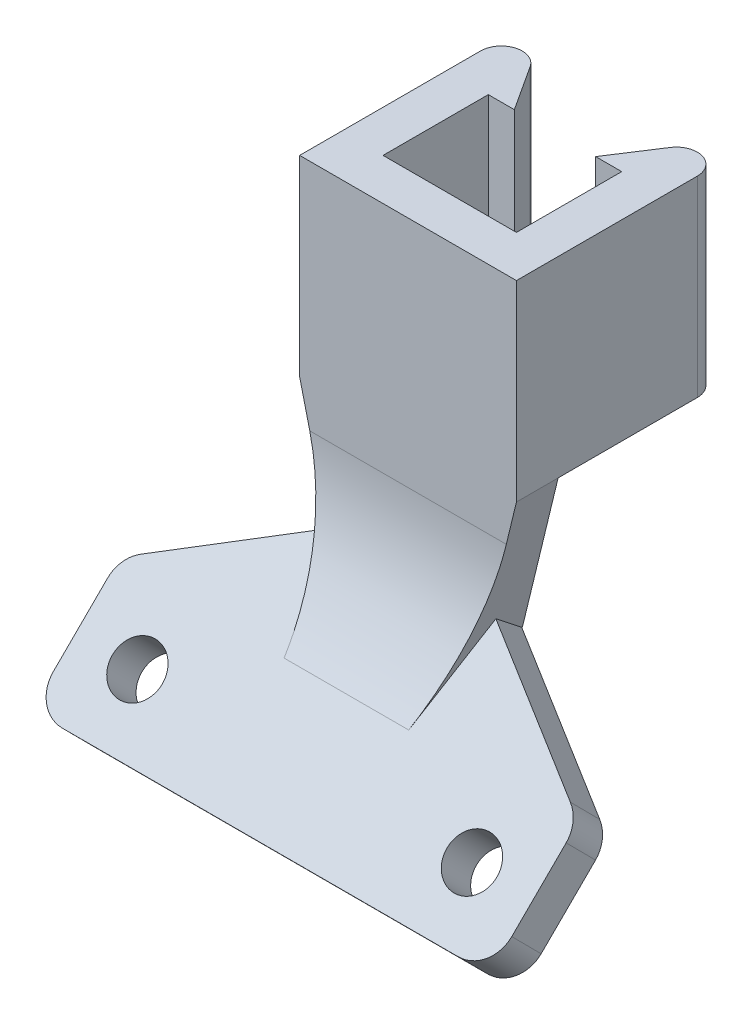
ISO-10303-21;
HEADER;
FILE_DESCRIPTION(('STEP AP214'),'2;1');
FILE_NAME('part.step','',(''),(''),'','','');
FILE_SCHEMA(('AUTOMOTIVE_DESIGN { 1 0 10303 214 1 1 1 1 }'));
ENDSEC;
DATA;
#1=APPLICATION_CONTEXT('core data for automotive mechanical design processes');
#2=APPLICATION_PROTOCOL_DEFINITION('international standard','automotive_design',2000,#1);
#3=PRODUCT_CONTEXT('',#1,'mechanical');
#4=PRODUCT('Part','Part','',(#3));
#5=PRODUCT_RELATED_PRODUCT_CATEGORY('part','',(#4));
#6=PRODUCT_DEFINITION_FORMATION('','',#4);
#7=PRODUCT_DEFINITION_CONTEXT('part definition',#1,'design');
#8=PRODUCT_DEFINITION('design','',#6,#7);
#9=PRODUCT_DEFINITION_SHAPE('','',#8);
#10=(LENGTH_UNIT() NAMED_UNIT(*) SI_UNIT(.MILLI.,.METRE.));
#11=(NAMED_UNIT(*) PLANE_ANGLE_UNIT() SI_UNIT($,.RADIAN.));
#12=(NAMED_UNIT(*) SI_UNIT($,.STERADIAN.) SOLID_ANGLE_UNIT());
#13=UNCERTAINTY_MEASURE_WITH_UNIT(LENGTH_MEASURE(1.E-05),#10,'distance_accuracy_value','');
#14=(GEOMETRIC_REPRESENTATION_CONTEXT(3) GLOBAL_UNCERTAINTY_ASSIGNED_CONTEXT((#13)) GLOBAL_UNIT_ASSIGNED_CONTEXT((#10,
#11,#12)) REPRESENTATION_CONTEXT('',''));
#15=CARTESIAN_POINT('',(0.,0.,0.));
#16=DIRECTION('',(0.,0.,1.));
#17=DIRECTION('',(1.,0.,0.));
#18=AXIS2_PLACEMENT_3D('',#15,#16,#17);
#19=CARTESIAN_POINT('',(0.3,-11.6,-10.0363471553719));
#20=DIRECTION('',(0.971753703944221,-0.235997328100739,0.));
#21=DIRECTION('',(0.235997328100739,0.971753703944221,0.));
#22=AXIS2_PLACEMENT_3D('',#19,#20,#21);
#23=PLANE('',#22);
#24=DIRECTION('',(-0.168592752666764,-0.694205452157264,0.699753723779568));
#25=VECTOR('',#24,1.);
#26=CARTESIAN_POINT('',(2.11397084096192,-4.13070830192151,-2.18923584850321));
#27=LINE('',#26,#25);
#28=CARTESIAN_POINT('',(0.60164791154541,-10.3579203642248,4.08774572203999));
#29=VERTEX_POINT('',#28);
#30=CARTESIAN_POINT('',(-0.210096759587173,-13.7003984218295,7.45693773888773));
#31=VERTEX_POINT('',#30);
#32=EDGE_CURVE('E84',#29,#31,#27,.T.);
#33=ORIENTED_EDGE('',*,*,#32,.F.);
#34=DIRECTION('',(-0.152960754174958,-0.629838399543945,-0.761515986793547));
#35=VECTOR('',#34,1.);
#36=CARTESIAN_POINT('',(-1.17027581491581,-17.6540768849475,-4.73378665309213));
#37=LINE('',#36,#35);
#38=CARTESIAN_POINT('',(0.3,-11.6,2.58598987451085));
#39=VERTEX_POINT('',#38);
#40=EDGE_CURVE('E482',#29,#39,#37,.T.);
#41=ORIENTED_EDGE('',*,*,#40,.T.);
#42=DIRECTION('',(0.,0.,1.));
#43=VECTOR('',#42,1.);
#44=CARTESIAN_POINT('',(0.3,-11.6,-10.0363471553719));
#45=LINE('',#44,#43);
#46=CARTESIAN_POINT('',(0.3,-11.6,2.5));
#47=VERTEX_POINT('',#46);
#48=EDGE_CURVE('E373',#47,#39,#45,.T.);
#49=ORIENTED_EDGE('',*,*,#48,.F.);
#50=DIRECTION('',(-0.235997328100739,-0.971753703944221,0.));
#51=VECTOR('',#50,1.);
#52=CARTESIAN_POINT('',(0.3,-11.6,2.5));
#53=LINE('',#52,#51);
#54=CARTESIAN_POINT('',(2.,-4.6,2.5));
#55=VERTEX_POINT('',#54);
#56=EDGE_CURVE('E278',#55,#47,#53,.T.);
#57=ORIENTED_EDGE('',*,*,#56,.F.);
#58=DIRECTION('',(0.,0.,-1.));
#59=VECTOR('',#58,1.);
#60=CARTESIAN_POINT('',(2.,-4.6,0.));
#61=LINE('',#60,#59);
#62=CARTESIAN_POINT('',(2.,-4.6,4.49980532051669));
#63=VERTEX_POINT('',#62);
#64=EDGE_CURVE('E446',#63,#55,#61,.T.);
#65=ORIENTED_EDGE('',*,*,#64,.F.);
#66=DIRECTION('',(0.235997328100739,0.971753703944221,0.));
#67=VECTOR('',#66,1.);
#68=CARTESIAN_POINT('',(0.3,-11.6,4.49980532051669));
#69=LINE('',#68,#67);
#70=CARTESIAN_POINT('',(1.51398398866313,-6.6012423996224,4.49980532051669));
#71=VERTEX_POINT('',#70);
#72=EDGE_CURVE('E369',#71,#63,#69,.T.);
#73=ORIENTED_EDGE('',*,*,#72,.F.);
#74=CARTESIAN_POINT('',(1.51398398866313,-6.6012423996224,14.4998053205167));
#75=DIRECTION('',(0.971753703944221,-0.235997328100739,0.));
#76=DIRECTION('',(0.235997328100739,0.971753703944221,0.));
#77=AXIS2_PLACEMENT_3D('',#74,#75,#76);
#78=ELLIPSE('',#77,10.2906734076869,10.);
#79=EDGE_CURVE('E77',#71,#31,#78,.F.);
#80=ORIENTED_EDGE('',*,*,#79,.T.);
#81=EDGE_LOOP('',(#33,#41,#49,#57,#65,#73,#80));
#82=FACE_BOUND('',#81,.T.);
#83=ADVANCED_FACE('F69',(#82),#23,.T.);
#84=CARTESIAN_POINT('',(2.,-4.6,0.));
#85=DIRECTION('',(0.,1.,0.));
#86=DIRECTION('',(0.,0.,1.));
#87=AXIS2_PLACEMENT_3D('',#84,#85,#86);
#88=PLANE('',#87);
#89=DIRECTION('',(1.,0.,0.));
#90=VECTOR('',#89,1.);
#91=CARTESIAN_POINT('',(2.,-4.6,2.5));
#92=LINE('',#91,#90);
#93=CARTESIAN_POINT('',(-8.4,-4.6,2.5));
#94=VERTEX_POINT('',#93);
#95=CARTESIAN_POINT('',(-6.4,-4.6,2.5));
#96=VERTEX_POINT('',#95);
#97=EDGE_CURVE('E375',#94,#96,#92,.T.);
#98=ORIENTED_EDGE('',*,*,#97,.F.);
#99=DIRECTION('',(0.,0.,1.));
#100=VECTOR('',#99,1.);
#101=CARTESIAN_POINT('',(-8.4,-4.6,-4.49980532051669));
#102=LINE('',#101,#100);
#103=CARTESIAN_POINT('',(-8.4,-4.6,-4.17663685509591));
#104=VERTEX_POINT('',#103);
#105=EDGE_CURVE('E422',#104,#94,#102,.T.);
#106=ORIENTED_EDGE('',*,*,#105,.F.);
#107=CARTESIAN_POINT('',(-7.4,-4.6,-4.17663685509591));
#108=DIRECTION('',(0.,1.,0.));
#109=DIRECTION('',(0.,0.,1.));
#110=AXIS2_PLACEMENT_3D('',#107,#108,#109);
#111=CIRCLE('',#110,1.);
#112=CARTESIAN_POINT('',(-6.56155638369936,-4.6,-4.72162520569133));
#113=VERTEX_POINT('',#112);
#114=EDGE_CURVE('E468',#104,#113,#111,.F.);
#115=ORIENTED_EDGE('',*,*,#114,.T.);
#116=DIRECTION('',(0.544988350595414,0.,0.838443616300637));
#117=VECTOR('',#116,1.);
#118=CARTESIAN_POINT('',(-2.45518453427065,-4.6,1.59586994727592));
#119=LINE('',#118,#117);
#120=CARTESIAN_POINT('',(-5.15,-4.6,-2.55));
#121=VERTEX_POINT('',#120);
#122=EDGE_CURVE('E412',#113,#121,#119,.T.);
#123=ORIENTED_EDGE('',*,*,#122,.T.);
#124=DIRECTION('',(-1.,0.,0.));
#125=VECTOR('',#124,1.);
#126=CARTESIAN_POINT('',(0.,-4.6,-2.54999999999998));
#127=LINE('',#126,#125);
#128=CARTESIAN_POINT('',(-6.4,-4.6,-2.55));
#129=VERTEX_POINT('',#128);
#130=EDGE_CURVE('E401',#121,#129,#127,.T.);
#131=ORIENTED_EDGE('',*,*,#130,.T.);
#132=DIRECTION('',(0.,0.,1.));
#133=VECTOR('',#132,1.);
#134=CARTESIAN_POINT('',(-6.4,-4.6,-4.49980532051669));
#135=LINE('',#134,#133);
#136=EDGE_CURVE('E417',#129,#96,#135,.T.);
#137=ORIENTED_EDGE('',*,*,#136,.T.);
#138=EDGE_LOOP('',(#98,#106,#115,#123,#131,#137));
#139=FACE_BOUND('',#138,.T.);
#140=ADVANCED_FACE('F596',(#139),#88,.F.);
#141=CARTESIAN_POINT('',(0.,-4.6,2.5));
#142=VERTEX_POINT('',#141);
#143=EDGE_CURVE('E388',#142,#55,#92,.T.);
#144=ORIENTED_EDGE('',*,*,#143,.F.);
#145=DIRECTION('',(0.,0.,-1.));
#146=VECTOR('',#145,1.);
#147=CARTESIAN_POINT('',(0.,-4.6,0.));
#148=LINE('',#147,#146);
#149=CARTESIAN_POINT('',(0.,-4.6,-2.55));
#150=VERTEX_POINT('',#149);
#151=EDGE_CURVE('E445',#142,#150,#148,.T.);
#152=ORIENTED_EDGE('',*,*,#151,.T.);
#153=DIRECTION('',(1.,0.,0.));
#154=VECTOR('',#153,1.);
#155=CARTESIAN_POINT('',(0.,-4.6,-2.55));
#156=LINE('',#155,#154);
#157=CARTESIAN_POINT('',(-1.25,-4.6,-2.55));
#158=VERTEX_POINT('',#157);
#159=EDGE_CURVE('E395',#158,#150,#156,.T.);
#160=ORIENTED_EDGE('',*,*,#159,.F.);
#161=DIRECTION('',(-0.544988350595414,0.,0.838443616300637));
#162=VECTOR('',#161,1.);
#163=CARTESIAN_POINT('',(-2.04393673110721,-4.6,-1.32855887521968));
#164=LINE('',#163,#162);
#165=CARTESIAN_POINT('',(0.161556383699363,-4.6,-4.72162520569133));
#166=VERTEX_POINT('',#165);
#167=EDGE_CURVE('E414',#166,#158,#164,.T.);
#168=ORIENTED_EDGE('',*,*,#167,.F.);
#169=CARTESIAN_POINT('',(1.,-4.6,-4.17663685509591));
#170=DIRECTION('',(0.,1.,0.));
#171=DIRECTION('',(0.,0.,1.));
#172=AXIS2_PLACEMENT_3D('',#169,#170,#171);
#173=CIRCLE('',#172,1.);
#174=CARTESIAN_POINT('',(2.,-4.6,-4.17663685509591));
#175=VERTEX_POINT('',#174);
#176=EDGE_CURVE('E470',#166,#175,#173,.F.);
#177=ORIENTED_EDGE('',*,*,#176,.T.);
#178=EDGE_CURVE('E444',#55,#175,#61,.T.);
#179=ORIENTED_EDGE('',*,*,#178,.F.);
#180=EDGE_LOOP('',(#144,#152,#160,#168,#177,#179));
#181=FACE_BOUND('',#180,.T.);
#182=ADVANCED_FACE('F540',(#181),#88,.F.);
#183=CARTESIAN_POINT('',(0.,0.,0.));
#184=DIRECTION('',(1.,0.,0.));
#185=DIRECTION('',(0.,0.,-1.));
#186=AXIS2_PLACEMENT_3D('',#183,#184,#185);
#187=PLANE('',#186);
#188=DIRECTION('',(0.,1.,0.));
#189=VECTOR('',#188,1.);
#190=CARTESIAN_POINT('',(0.,-8.23792462627519,-2.55));
#191=LINE('',#190,#189);
#192=CARTESIAN_POINT('',(0.,4.6,-2.55));
#193=VERTEX_POINT('',#192);
#194=EDGE_CURVE('E392',#150,#193,#191,.T.);
#195=ORIENTED_EDGE('',*,*,#194,.F.);
#196=ORIENTED_EDGE('',*,*,#151,.F.);
#197=DIRECTION('',(0.,-1.,0.));
#198=VECTOR('',#197,1.);
#199=CARTESIAN_POINT('',(0.,4.6,2.5));
#200=LINE('',#199,#198);
#201=CARTESIAN_POINT('',(0.,4.6,2.5));
#202=VERTEX_POINT('',#201);
#203=EDGE_CURVE('E432',#202,#142,#200,.T.);
#204=ORIENTED_EDGE('',*,*,#203,.F.);
#205=DIRECTION('',(0.,0.,-1.));
#206=VECTOR('',#205,1.);
#207=CARTESIAN_POINT('',(0.,4.6,0.));
#208=LINE('',#207,#206);
#209=EDGE_CURVE('E449',#202,#193,#208,.T.);
#210=ORIENTED_EDGE('',*,*,#209,.T.);
#211=EDGE_LOOP('',(#195,#196,#204,#210));
#212=FACE_BOUND('',#211,.T.);
#213=ADVANCED_FACE('F549',(#212),#187,.F.);
#214=CARTESIAN_POINT('',(2.,4.6,0.));
#215=DIRECTION('',(0.,1.,0.));
#216=DIRECTION('',(0.,0.,1.));
#217=AXIS2_PLACEMENT_3D('',#214,#215,#216);
#218=PLANE('',#217);
#219=DIRECTION('',(0.,0.,-1.));
#220=VECTOR('',#219,1.);
#221=CARTESIAN_POINT('',(2.,4.6,0.));
#222=LINE('',#221,#220);
#223=CARTESIAN_POINT('',(2.,4.6,4.49980532051669));
#224=VERTEX_POINT('',#223);
#225=CARTESIAN_POINT('',(2.,4.6,-4.17663685509591));
#226=VERTEX_POINT('',#225);
#227=EDGE_CURVE('E441',#224,#226,#222,.T.);
#228=ORIENTED_EDGE('',*,*,#227,.T.);
#229=CARTESIAN_POINT('',(1.,4.6,-4.17663685509591));
#230=DIRECTION('',(0.,1.,0.));
#231=DIRECTION('',(0.,0.,1.));
#232=AXIS2_PLACEMENT_3D('',#229,#230,#231);
#233=CIRCLE('',#232,1.);
#234=CARTESIAN_POINT('',(0.161556383699363,4.6,-4.72162520569133));
#235=VERTEX_POINT('',#234);
#236=EDGE_CURVE('E464',#226,#235,#233,.T.);
#237=ORIENTED_EDGE('',*,*,#236,.T.);
#238=DIRECTION('',(0.544988350595414,0.,-0.838443616300637));
#239=VECTOR('',#238,1.);
#240=CARTESIAN_POINT('',(-2.04393673110721,4.6,-1.32855887521968));
#241=LINE('',#240,#239);
#242=CARTESIAN_POINT('',(-1.25,4.6,-2.55));
#243=VERTEX_POINT('',#242);
#244=EDGE_CURVE('E403',#243,#235,#241,.T.);
#245=ORIENTED_EDGE('',*,*,#244,.F.);
#246=DIRECTION('',(-1.,0.,0.));
#247=VECTOR('',#246,1.);
#248=CARTESIAN_POINT('',(0.,4.6,-2.55));
#249=LINE('',#248,#247);
#250=EDGE_CURVE('E387',#193,#243,#249,.T.);
#251=ORIENTED_EDGE('',*,*,#250,.F.);
#252=ORIENTED_EDGE('',*,*,#209,.F.);
#253=DIRECTION('',(1.,0.,0.));
#254=VECTOR('',#253,1.);
#255=CARTESIAN_POINT('',(-7.,4.6,2.5));
#256=LINE('',#255,#254);
#257=CARTESIAN_POINT('',(-6.4,4.6,2.5));
#258=VERTEX_POINT('',#257);
#259=EDGE_CURVE('E438',#258,#202,#256,.T.);
#260=ORIENTED_EDGE('',*,*,#259,.F.);
#261=DIRECTION('',(0.,0.,-1.));
#262=VECTOR('',#261,1.);
#263=CARTESIAN_POINT('',(-6.4,4.6,4.49980532051669));
#264=LINE('',#263,#262);
#265=CARTESIAN_POINT('',(-6.4,4.6,-2.55));
#266=VERTEX_POINT('',#265);
#267=EDGE_CURVE('E426',#258,#266,#264,.T.);
#268=ORIENTED_EDGE('',*,*,#267,.T.);
#269=DIRECTION('',(1.,0.,0.));
#270=VECTOR('',#269,1.);
#271=CARTESIAN_POINT('',(0.,4.6,-2.54999999999998));
#272=LINE('',#271,#270);
#273=CARTESIAN_POINT('',(-5.15,4.6,-2.55));
#274=VERTEX_POINT('',#273);
#275=EDGE_CURVE('E400',#266,#274,#272,.T.);
#276=ORIENTED_EDGE('',*,*,#275,.T.);
#277=DIRECTION('',(-0.544988350595414,0.,-0.838443616300637));
#278=VECTOR('',#277,1.);
#279=CARTESIAN_POINT('',(-2.45518453427065,4.6,1.59586994727592));
#280=LINE('',#279,#278);
#281=CARTESIAN_POINT('',(-6.56155638369936,4.6,-4.72162520569133));
#282=VERTEX_POINT('',#281);
#283=EDGE_CURVE('E415',#274,#282,#280,.T.);
#284=ORIENTED_EDGE('',*,*,#283,.T.);
#285=CARTESIAN_POINT('',(-7.4,4.6,-4.17663685509591));
#286=DIRECTION('',(0.,1.,0.));
#287=DIRECTION('',(0.,0.,1.));
#288=AXIS2_PLACEMENT_3D('',#285,#286,#287);
#289=CIRCLE('',#288,1.);
#290=CARTESIAN_POINT('',(-8.4,4.6,-4.17663685509591));
#291=VERTEX_POINT('',#290);
#292=EDGE_CURVE('E462',#282,#291,#289,.T.);
#293=ORIENTED_EDGE('',*,*,#292,.T.);
#294=DIRECTION('',(0.,0.,-1.));
#295=VECTOR('',#294,1.);
#296=CARTESIAN_POINT('',(-8.4,4.6,4.49980532051669));
#297=LINE('',#296,#295);
#298=CARTESIAN_POINT('',(-8.4,4.6,4.49980532051669));
#299=VERTEX_POINT('',#298);
#300=EDGE_CURVE('E429',#299,#291,#297,.T.);
#301=ORIENTED_EDGE('',*,*,#300,.F.);
#302=DIRECTION('',(-1.,0.,0.));
#303=VECTOR('',#302,1.);
#304=CARTESIAN_POINT('',(2.,4.6,4.49980532051669));
#305=LINE('',#304,#303);
#306=EDGE_CURVE('E451',#224,#299,#305,.T.);
#307=ORIENTED_EDGE('',*,*,#306,.F.);
#308=EDGE_LOOP('',(#228,#237,#245,#251,#252,#260,#268,#276,#284,#293,#301,#307));
#309=FACE_BOUND('',#308,.T.);
#310=ADVANCED_FACE('F552',(#309),#218,.T.);
#311=CARTESIAN_POINT('',(-6.4,0.,0.));
#312=DIRECTION('',(-1.,0.,0.));
#313=DIRECTION('',(0.,0.,1.));
#314=AXIS2_PLACEMENT_3D('',#311,#312,#313);
#315=PLANE('',#314);
#316=ORIENTED_EDGE('',*,*,#136,.F.);
#317=DIRECTION('',(0.,1.,0.));
#318=VECTOR('',#317,1.);
#319=CARTESIAN_POINT('',(-6.4,-8.23792462627519,-2.55));
#320=LINE('',#319,#318);
#321=EDGE_CURVE('E404',#129,#266,#320,.T.);
#322=ORIENTED_EDGE('',*,*,#321,.T.);
#323=ORIENTED_EDGE('',*,*,#267,.F.);
#324=DIRECTION('',(0.,-1.,0.));
#325=VECTOR('',#324,1.);
#326=CARTESIAN_POINT('',(-6.4,4.6,2.5));
#327=LINE('',#326,#325);
#328=EDGE_CURVE('E448',#258,#96,#327,.T.);
#329=ORIENTED_EDGE('',*,*,#328,.T.);
#330=EDGE_LOOP('',(#316,#322,#323,#329));
#331=FACE_BOUND('',#330,.T.);
#332=ADVANCED_FACE('F621',(#331),#315,.F.);
#333=CARTESIAN_POINT('',(-7.,4.6,2.5));
#334=DIRECTION('',(0.,0.,1.));
#335=DIRECTION('',(0.,-1.,0.));
#336=AXIS2_PLACEMENT_3D('',#333,#334,#335);
#337=PLANE('',#336);
#338=ORIENTED_EDGE('',*,*,#328,.F.);
#339=ORIENTED_EDGE('',*,*,#259,.T.);
#340=ORIENTED_EDGE('',*,*,#203,.T.);
#341=ORIENTED_EDGE('',*,*,#143,.T.);
#342=ORIENTED_EDGE('',*,*,#56,.T.);
#343=DIRECTION('',(-7.46446051510161E-13,-1.,0.));
#344=VECTOR('',#343,1.);
#345=CARTESIAN_POINT('',(0.3,-11.6,2.5));
#346=LINE('',#345,#344);
#347=CARTESIAN_POINT('',(0.299999999999968,-11.6429935750087,2.5));
#348=VERTEX_POINT('',#347);
#349=EDGE_CURVE('E259',#47,#348,#346,.T.);
#350=ORIENTED_EDGE('',*,*,#349,.T.);
#351=DIRECTION('',(-1.,0.,0.));
#352=VECTOR('',#351,1.);
#353=CARTESIAN_POINT('',(0.299999999999968,-11.6429935750087,2.5));
#354=LINE('',#353,#352);
#355=CARTESIAN_POINT('',(-6.70000000000002,-11.6429935750088,2.5));
#356=VERTEX_POINT('',#355);
#357=EDGE_CURVE('E268',#348,#356,#354,.T.);
#358=ORIENTED_EDGE('',*,*,#357,.T.);
#359=DIRECTION('',(5.04355440208836E-13,1.,0.));
#360=VECTOR('',#359,1.);
#361=CARTESIAN_POINT('',(-6.70000000000002,-11.6429935750088,2.5));
#362=LINE('',#361,#360);
#363=CARTESIAN_POINT('',(-6.7,-11.6,2.5));
#364=VERTEX_POINT('',#363);
#365=EDGE_CURVE('E265',#356,#364,#362,.T.);
#366=ORIENTED_EDGE('',*,*,#365,.T.);
#367=DIRECTION('',(-0.23599732810074,0.971753703944221,0.));
#368=VECTOR('',#367,1.);
#369=CARTESIAN_POINT('',(-6.7,-11.6,2.5));
#370=LINE('',#369,#368);
#371=EDGE_CURVE('E370',#364,#94,#370,.T.);
#372=ORIENTED_EDGE('',*,*,#371,.T.);
#373=ORIENTED_EDGE('',*,*,#97,.T.);
#374=EDGE_LOOP('',(#338,#339,#340,#341,#342,#350,#358,#366,#372,#373));
#375=FACE_BOUND('',#374,.T.);
#376=ADVANCED_FACE('F275',(#375),#337,.F.);
#377=CARTESIAN_POINT('',(2.,0.,0.));
#378=DIRECTION('',(1.,0.,0.));
#379=DIRECTION('',(0.,0.,-1.));
#380=AXIS2_PLACEMENT_3D('',#377,#378,#379);
#381=PLANE('',#380);
#382=ORIENTED_EDGE('',*,*,#64,.T.);
#383=ORIENTED_EDGE('',*,*,#178,.T.);
#384=DIRECTION('',(0.,1.,0.));
#385=VECTOR('',#384,1.);
#386=CARTESIAN_POINT('',(2.,4.6,-4.17663685509591));
#387=LINE('',#386,#385);
#388=EDGE_CURVE('E459',#175,#226,#387,.T.);
#389=ORIENTED_EDGE('',*,*,#388,.T.);
#390=ORIENTED_EDGE('',*,*,#227,.F.);
#391=DIRECTION('',(0.,-1.,0.));
#392=VECTOR('',#391,1.);
#393=CARTESIAN_POINT('',(2.,4.6,4.49980532051669));
#394=LINE('',#393,#392);
#395=EDGE_CURVE('E440',#224,#63,#394,.T.);
#396=ORIENTED_EDGE('',*,*,#395,.T.);
#397=EDGE_LOOP('',(#382,#383,#389,#390,#396));
#398=FACE_BOUND('',#397,.T.);
#399=ADVANCED_FACE('F537',(#398),#381,.T.);
#400=CARTESIAN_POINT('',(2.,4.6,4.49980532051669));
#401=DIRECTION('',(0.,0.,-1.));
#402=DIRECTION('',(-1.,0.,0.));
#403=AXIS2_PLACEMENT_3D('',#400,#401,#402);
#404=PLANE('',#403);
#405=DIRECTION('',(0.23599732810074,-0.971753703944221,0.));
#406=VECTOR('',#405,1.);
#407=CARTESIAN_POINT('',(-6.7,-11.6,4.49980532051669));
#408=LINE('',#407,#406);
#409=CARTESIAN_POINT('',(-8.4,-4.6,4.49980532051669));
#410=VERTEX_POINT('',#409);
#411=CARTESIAN_POINT('',(-7.91398398866313,-6.6012423996224,4.49980532051669));
#412=VERTEX_POINT('',#411);
#413=EDGE_CURVE('E377',#410,#412,#408,.T.);
#414=ORIENTED_EDGE('',*,*,#413,.T.);
#415=DIRECTION('',(1.,0.,0.));
#416=VECTOR('',#415,1.);
#417=CARTESIAN_POINT('',(2.,-6.6012423996224,4.49980532051669));
#418=LINE('',#417,#416);
#419=EDGE_CURVE('E484',#412,#71,#418,.T.);
#420=ORIENTED_EDGE('',*,*,#419,.T.);
#421=ORIENTED_EDGE('',*,*,#72,.T.);
#422=ORIENTED_EDGE('',*,*,#395,.F.);
#423=ORIENTED_EDGE('',*,*,#306,.T.);
#424=DIRECTION('',(0.,1.,0.));
#425=VECTOR('',#424,1.);
#426=CARTESIAN_POINT('',(-8.4,-4.6,4.49980532051669));
#427=LINE('',#426,#425);
#428=EDGE_CURVE('E425',#410,#299,#427,.T.);
#429=ORIENTED_EDGE('',*,*,#428,.F.);
#430=EDGE_LOOP('',(#414,#420,#421,#422,#423,#429));
#431=FACE_BOUND('',#430,.T.);
#432=ADVANCED_FACE('F566',(#431),#404,.F.);
#433=CARTESIAN_POINT('',(-8.4,0.,0.));
#434=DIRECTION('',(-1.,0.,0.));
#435=DIRECTION('',(0.,0.,1.));
#436=AXIS2_PLACEMENT_3D('',#433,#434,#435);
#437=PLANE('',#436);
#438=ORIENTED_EDGE('',*,*,#300,.T.);
#439=DIRECTION('',(0.,1.,0.));
#440=VECTOR('',#439,1.);
#441=CARTESIAN_POINT('',(-8.4,0.,-4.17663685509591));
#442=LINE('',#441,#440);
#443=EDGE_CURVE('E476',#291,#104,#442,.F.);
#444=ORIENTED_EDGE('',*,*,#443,.T.);
#445=ORIENTED_EDGE('',*,*,#105,.T.);
#446=DIRECTION('',(0.,0.,1.));
#447=VECTOR('',#446,1.);
#448=CARTESIAN_POINT('',(-8.4,-4.6,-10.0363471553719));
#449=LINE('',#448,#447);
#450=EDGE_CURVE('E380',#94,#410,#449,.T.);
#451=ORIENTED_EDGE('',*,*,#450,.T.);
#452=ORIENTED_EDGE('',*,*,#428,.T.);
#453=EDGE_LOOP('',(#438,#444,#445,#451,#452));
#454=FACE_BOUND('',#453,.T.);
#455=ADVANCED_FACE('F572',(#454),#437,.T.);
#456=CARTESIAN_POINT('',(-2.45518453427065,-16.1394973894013,1.59586994727592));
#457=DIRECTION('',(0.838443616300637,0.,-0.544988350595414));
#458=DIRECTION('',(-0.544988350595414,0.,-0.838443616300637));
#459=AXIS2_PLACEMENT_3D('',#456,#457,#458);
#460=PLANE('',#459);
#461=ORIENTED_EDGE('',*,*,#122,.F.);
#462=DIRECTION('',(0.,1.,0.));
#463=VECTOR('',#462,1.);
#464=CARTESIAN_POINT('',(-6.56155638369936,-16.1394973894013,-4.72162520569133));
#465=LINE('',#464,#463);
#466=EDGE_CURVE('E473',#113,#282,#465,.T.);
#467=ORIENTED_EDGE('',*,*,#466,.T.);
#468=ORIENTED_EDGE('',*,*,#283,.F.);
#469=DIRECTION('',(0.,1.,0.));
#470=VECTOR('',#469,1.);
#471=CARTESIAN_POINT('',(-5.15,-8.23792462627519,-2.55));
#472=LINE('',#471,#470);
#473=EDGE_CURVE('E407',#121,#274,#472,.T.);
#474=ORIENTED_EDGE('',*,*,#473,.F.);
#475=EDGE_LOOP('',(#461,#467,#468,#474));
#476=FACE_BOUND('',#475,.T.);
#477=ADVANCED_FACE('F613',(#476),#460,.T.);
#478=CARTESIAN_POINT('',(-2.04393673110721,-16.1394973894013,-1.32855887521968));
#479=DIRECTION('',(0.838443616300637,0.,0.544988350595414));
#480=DIRECTION('',(0.544988350595414,0.,-0.838443616300637));
#481=AXIS2_PLACEMENT_3D('',#478,#479,#480);
#482=PLANE('',#481);
#483=ORIENTED_EDGE('',*,*,#244,.T.);
#484=DIRECTION('',(0.,1.,0.));
#485=VECTOR('',#484,1.);
#486=CARTESIAN_POINT('',(0.161556383699363,-4.6,-4.72162520569133));
#487=LINE('',#486,#485);
#488=EDGE_CURVE('E466',#235,#166,#487,.F.);
#489=ORIENTED_EDGE('',*,*,#488,.T.);
#490=ORIENTED_EDGE('',*,*,#167,.T.);
#491=DIRECTION('',(0.,1.,0.));
#492=VECTOR('',#491,1.);
#493=CARTESIAN_POINT('',(-1.25,-8.23792462627519,-2.55));
#494=LINE('',#493,#492);
#495=EDGE_CURVE('E391',#158,#243,#494,.T.);
#496=ORIENTED_EDGE('',*,*,#495,.T.);
#497=EDGE_LOOP('',(#483,#489,#490,#496));
#498=FACE_BOUND('',#497,.T.);
#499=ADVANCED_FACE('F611',(#498),#482,.F.);
#500=CARTESIAN_POINT('',(0.,-8.23792462627519,-2.54999999999998));
#501=DIRECTION('',(0.,0.,1.));
#502=DIRECTION('',(1.,0.,0.));
#503=AXIS2_PLACEMENT_3D('',#500,#501,#502);
#504=PLANE('',#503);
#505=ORIENTED_EDGE('',*,*,#130,.F.);
#506=ORIENTED_EDGE('',*,*,#473,.T.);
#507=ORIENTED_EDGE('',*,*,#275,.F.);
#508=ORIENTED_EDGE('',*,*,#321,.F.);
#509=EDGE_LOOP('',(#505,#506,#507,#508));
#510=FACE_BOUND('',#509,.T.);
#511=ADVANCED_FACE('F608',(#510),#504,.T.);
#512=CARTESIAN_POINT('',(0.,-8.23792462627519,-2.55));
#513=DIRECTION('',(0.,0.,-1.));
#514=DIRECTION('',(-1.,0.,0.));
#515=AXIS2_PLACEMENT_3D('',#512,#513,#514);
#516=PLANE('',#515);
#517=ORIENTED_EDGE('',*,*,#495,.F.);
#518=ORIENTED_EDGE('',*,*,#159,.T.);
#519=ORIENTED_EDGE('',*,*,#194,.T.);
#520=ORIENTED_EDGE('',*,*,#250,.T.);
#521=EDGE_LOOP('',(#517,#518,#519,#520));
#522=FACE_BOUND('',#521,.T.);
#523=ADVANCED_FACE('F556',(#522),#516,.F.);
#524=CARTESIAN_POINT('',(1.,0.,-4.17663685509591));
#525=DIRECTION('',(0.,-1.,0.));
#526=DIRECTION('',(0.,0.,-1.));
#527=AXIS2_PLACEMENT_3D('',#524,#525,#526);
#528=CYLINDRICAL_SURFACE('',#527,1.);
#529=ORIENTED_EDGE('',*,*,#176,.F.);
#530=ORIENTED_EDGE('',*,*,#488,.F.);
#531=ORIENTED_EDGE('',*,*,#236,.F.);
#532=ORIENTED_EDGE('',*,*,#388,.F.);
#533=EDGE_LOOP('',(#529,#530,#531,#532));
#534=FACE_BOUND('',#533,.T.);
#535=ADVANCED_FACE('F561',(#534),#528,.T.);
#536=CARTESIAN_POINT('',(-7.4,-16.1394973894013,-4.17663685509591));
#537=DIRECTION('',(0.,1.,0.));
#538=DIRECTION('',(0.,0.,1.));
#539=AXIS2_PLACEMENT_3D('',#536,#537,#538);
#540=CYLINDRICAL_SURFACE('',#539,1.);
#541=ORIENTED_EDGE('',*,*,#114,.F.);
#542=ORIENTED_EDGE('',*,*,#443,.F.);
#543=ORIENTED_EDGE('',*,*,#292,.F.);
#544=ORIENTED_EDGE('',*,*,#466,.F.);
#545=EDGE_LOOP('',(#541,#542,#543,#544));
#546=FACE_BOUND('',#545,.T.);
#547=ADVANCED_FACE('F635',(#546),#540,.T.);
#548=CARTESIAN_POINT('',(-6.7,-11.6,-10.0363471553719));
#549=DIRECTION('',(-0.971753703944221,-0.23599732810074,0.));
#550=DIRECTION('',(0.23599732810074,-0.971753703944221,0.));
#551=AXIS2_PLACEMENT_3D('',#548,#549,#550);
#552=PLANE('',#551);
#553=DIRECTION('',(0.152960754174958,-0.629838399543942,-0.76151598679355));
#554=VECTOR('',#553,1.);
#555=CARTESIAN_POINT('',(-5.22972418508418,-17.6540768849475,-4.73378665309215));
#556=LINE('',#555,#554);
#557=CARTESIAN_POINT('',(-7.0016479115454,-10.3579203642248,4.08774572204003));
#558=VERTEX_POINT('',#557);
#559=CARTESIAN_POINT('',(-6.7,-11.6,2.5859898745109));
#560=VERTEX_POINT('',#559);
#561=EDGE_CURVE('E479',#558,#560,#556,.T.);
#562=ORIENTED_EDGE('',*,*,#561,.F.);
#563=DIRECTION('',(-0.168592752666764,0.694205452157264,-0.699753723779568));
#564=VECTOR('',#563,1.);
#565=CARTESIAN_POINT('',(-8.51397084096192,-4.13070830192151,-2.18923584850321));
#566=LINE('',#565,#564);
#567=CARTESIAN_POINT('',(-6.18990324041283,-13.7003984218295,7.45693773888773));
#568=VERTEX_POINT('',#567);
#569=EDGE_CURVE('E91',#568,#558,#566,.T.);
#570=ORIENTED_EDGE('',*,*,#569,.F.);
#571=CARTESIAN_POINT('',(-7.91398398866313,-6.6012423996224,14.4998053205167));
#572=DIRECTION('',(-0.971753703944221,-0.23599732810074,0.));
#573=DIRECTION('',(0.23599732810074,-0.971753703944221,0.));
#574=AXIS2_PLACEMENT_3D('',#571,#572,#573);
#575=ELLIPSE('',#574,10.2906734076869,10.);
#576=EDGE_CURVE('E12',#568,#412,#575,.F.);
#577=ORIENTED_EDGE('',*,*,#576,.T.);
#578=ORIENTED_EDGE('',*,*,#413,.F.);
#579=ORIENTED_EDGE('',*,*,#450,.F.);
#580=ORIENTED_EDGE('',*,*,#371,.F.);
#581=DIRECTION('',(0.,0.,1.));
#582=VECTOR('',#581,1.);
#583=CARTESIAN_POINT('',(-6.7,-11.6,-10.0363471553719));
#584=LINE('',#583,#582);
#585=EDGE_CURVE('E382',#364,#560,#584,.T.);
#586=ORIENTED_EDGE('',*,*,#585,.T.);
#587=EDGE_LOOP('',(#562,#570,#577,#578,#579,#580,#586));
#588=FACE_BOUND('',#587,.T.);
#589=ADVANCED_FACE('F569',(#588),#552,.T.);
#590=CARTESIAN_POINT('',(7.79999999999986,-3.17637828282152,-3.15119312282979));
#591=DIRECTION('',(-1.,0.,0.));
#592=DIRECTION('',(0.,-1.,0.));
#593=AXIS2_PLACEMENT_3D('',#590,#591,#592);
#594=PLANE('',#593);
#595=DIRECTION('',(0.,0.704286758162896,-0.709915602220714));
#596=VECTOR('',#595,1.);
#597=CARTESIAN_POINT('',(7.79999999999986,-4.59620948726294,-4.55976663915558));
#598=LINE('',#597,#596);
#599=CARTESIAN_POINT('',(7.80000000000008,-18.1628291546266,9.11528100248737));
#600=VERTEX_POINT('',#599);
#601=CARTESIAN_POINT('',(7.80000000000003,-15.5744655808084,6.50623054970534));
#602=VERTEX_POINT('',#601);
#603=EDGE_CURVE('E322',#600,#602,#598,.T.);
#604=ORIENTED_EDGE('',*,*,#603,.T.);
#605=DIRECTION('',(0.,-0.709915602220714,-0.704286758162896));
#606=VECTOR('',#605,1.);
#607=CARTESIAN_POINT('',(7.80000000000003,-14.154634376367,7.91480406603113));
#608=LINE('',#607,#606);
#609=CARTESIAN_POINT('',(7.80000000000003,-14.154634376367,7.91480406603113));
#610=VERTEX_POINT('',#609);
#611=EDGE_CURVE('E365',#610,#602,#608,.T.);
#612=ORIENTED_EDGE('',*,*,#611,.F.);
#613=DIRECTION('',(0.,0.704286758162896,-0.709915602220714));
#614=VECTOR('',#613,1.);
#615=CARTESIAN_POINT('',(7.79999999999986,-3.17637828282152,-3.15119312282979));
#616=LINE('',#615,#614);
#617=CARTESIAN_POINT('',(7.80000000000008,-16.7429979501852,10.5238545188132));
#618=VERTEX_POINT('',#617);
#619=EDGE_CURVE('E292',#618,#610,#616,.T.);
#620=ORIENTED_EDGE('',*,*,#619,.F.);
#621=DIRECTION('',(0.,-0.709915602220714,-0.704286758162896));
#622=VECTOR('',#621,1.);
#623=CARTESIAN_POINT('',(7.80000000000008,-16.7429979501852,10.5238545188132));
#624=LINE('',#623,#622);
#625=EDGE_CURVE('E316',#618,#600,#624,.T.);
#626=ORIENTED_EDGE('',*,*,#625,.T.);
#627=EDGE_LOOP('',(#604,#612,#620,#626));
#628=FACE_BOUND('',#627,.T.);
#629=ADVANCED_FACE('F527',(#628),#594,.F.);
#630=CARTESIAN_POINT('',(6.30000000000003,-14.154634376367,7.91480406603115));
#631=DIRECTION('',(0.,-0.709915602220714,-0.704286758162896));
#632=DIRECTION('',(0.,0.704286758162896,-0.709915602220714));
#633=AXIS2_PLACEMENT_3D('',#630,#631,#632);
#634=CYLINDRICAL_SURFACE('',#633,1.5);
#635=CARTESIAN_POINT('',(6.30000000000003,-15.5744655808085,6.50623054970535));
#636=DIRECTION('',(0.,0.709915602220714,0.704286758162896));
#637=DIRECTION('',(0.,-0.704286758162896,0.709915602220714));
#638=AXIS2_PLACEMENT_3D('',#635,#636,#637);
#639=CIRCLE('',#638,1.5);
#640=CARTESIAN_POINT('',(7.10346501109258,-14.682369150714,5.6070042515119));
#641=VERTEX_POINT('',#640);
#642=EDGE_CURVE('E325',#602,#641,#639,.T.);
#643=ORIENTED_EDGE('',*,*,#642,.T.);
#644=DIRECTION('',(0.,-0.709915602220714,-0.704286758162896));
#645=VECTOR('',#644,1.);
#646=CARTESIAN_POINT('',(7.10346501109258,-13.2625379462725,7.01557776783769));
#647=LINE('',#646,#645);
#648=CARTESIAN_POINT('',(7.10346501109258,-13.2625379462725,7.01557776783769));
#649=VERTEX_POINT('',#648);
#650=EDGE_CURVE('E362',#649,#641,#647,.T.);
#651=ORIENTED_EDGE('',*,*,#650,.F.);
#652=CARTESIAN_POINT('',(6.30000000000003,-14.154634376367,7.91480406603115));
#653=DIRECTION('',(0.,0.709915602220714,0.704286758162896));
#654=DIRECTION('',(0.,-0.704286758162896,0.709915602220714));
#655=AXIS2_PLACEMENT_3D('',#652,#653,#654);
#656=CIRCLE('',#655,1.5);
#657=EDGE_CURVE('E295',#610,#649,#656,.T.);
#658=ORIENTED_EDGE('',*,*,#657,.F.);
#659=ORIENTED_EDGE('',*,*,#611,.T.);
#660=EDGE_LOOP('',(#643,#651,#658,#659));
#661=FACE_BOUND('',#660,.T.);
#662=ADVANCED_FACE('F530',(#661),#634,.T.);
#663=CARTESIAN_POINT('',(-4.43965097194582,-8.10577374903221,1.81759936179282));
#664=DIRECTION('',(-0.535643340728363,-0.594730953396336,0.599484198795635));
#665=DIRECTION('',(0.,-0.709915602220714,-0.704286758162896));
#666=AXIS2_PLACEMENT_3D('',#663,#664,#665);
#667=PLANE('',#666);
#668=ORIENTED_EDGE('',*,*,#40,.F.);
#669=DIRECTION('',(-0.844444321156439,0.377246511973122,-0.380261564808691));
#670=VECTOR('',#669,1.);
#671=CARTESIAN_POINT('',(-4.43965097194582,-8.10577374903221,1.81759936179282));
#672=LINE('',#671,#670);
#673=EDGE_CURVE('E297',#649,#29,#672,.T.);
#674=ORIENTED_EDGE('',*,*,#673,.F.);
#675=ORIENTED_EDGE('',*,*,#650,.T.);
#676=DIRECTION('',(-0.844444321156439,0.377246511973122,-0.380261564808691));
#677=VECTOR('',#676,1.);
#678=CARTESIAN_POINT('',(-4.43965097194582,-9.52560495347364,0.409025845467029));
#679=LINE('',#678,#677);
#680=CARTESIAN_POINT('',(0.299999999999968,-11.6429935750087,2.54333719091007));
#681=VERTEX_POINT('',#680);
#682=EDGE_CURVE('E327',#641,#681,#679,.T.);
#683=ORIENTED_EDGE('',*,*,#682,.T.);
#684=DIRECTION('',(0.,-0.709915602220714,-0.704286758162896));
#685=VECTOR('',#684,1.);
#686=CARTESIAN_POINT('',(0.299999999999968,-10.2231623705673,3.95191070723587));
#687=LINE('',#686,#685);
#688=EDGE_CURVE('E261',#39,#681,#687,.T.);
#689=ORIENTED_EDGE('',*,*,#688,.F.);
#690=EDGE_LOOP('',(#668,#674,#675,#683,#689));
#691=FACE_BOUND('',#690,.T.);
#692=ADVANCED_FACE('F534',(#691),#667,.F.);
#693=CARTESIAN_POINT('',(2.60340272575931,-6.06696623087669,-0.237502839530589));
#694=DIRECTION('',(-0.535643340728381,0.594730953396328,-0.599484198795627));
#695=DIRECTION('',(0.,0.709915602220714,0.704286758162896));
#696=AXIS2_PLACEMENT_3D('',#693,#694,#695);
#697=PLANE('',#696);
#698=DIRECTION('',(0.844444321156428,0.377246511973135,-0.380261564808703));
#699=VECTOR('',#698,1.);
#700=CARTESIAN_POINT('',(2.60340272575931,-6.06696623087669,-0.237502839530589));
#701=LINE('',#700,#699);
#702=CARTESIAN_POINT('',(-13.5034650110925,-13.2625379462727,7.01557776783785));
#703=VERTEX_POINT('',#702);
#704=EDGE_CURVE('E299',#703,#558,#701,.T.);
#705=ORIENTED_EDGE('',*,*,#704,.T.);
#706=ORIENTED_EDGE('',*,*,#561,.T.);
#707=DIRECTION('',(0.,-0.709915602220714,-0.704286758162896));
#708=VECTOR('',#707,1.);
#709=CARTESIAN_POINT('',(-6.70000000000002,-10.2231623705674,3.95191070723593));
#710=LINE('',#709,#708);
#711=CARTESIAN_POINT('',(-6.70000000000002,-11.6429935750088,2.54333719091011));
#712=VERTEX_POINT('',#711);
#713=EDGE_CURVE('E358',#560,#712,#710,.T.);
#714=ORIENTED_EDGE('',*,*,#713,.T.);
#715=DIRECTION('',(0.844444321156428,0.377246511973135,-0.380261564808703));
#716=VECTOR('',#715,1.);
#717=CARTESIAN_POINT('',(2.60340272575931,-7.48679743531811,-1.64607635585638));
#718=LINE('',#717,#716);
#719=CARTESIAN_POINT('',(-13.5034650110925,-14.6823691507141,5.60700425151205));
#720=VERTEX_POINT('',#719);
#721=EDGE_CURVE('E331',#720,#712,#718,.T.);
#722=ORIENTED_EDGE('',*,*,#721,.F.);
#723=DIRECTION('',(0.,-0.709915602220714,-0.704286758162896));
#724=VECTOR('',#723,1.);
#725=CARTESIAN_POINT('',(-13.5034650110925,-13.2625379462727,7.01557776783785));
#726=LINE('',#725,#724);
#727=EDGE_CURVE('E356',#703,#720,#726,.T.);
#728=ORIENTED_EDGE('',*,*,#727,.F.);
#729=EDGE_LOOP('',(#705,#706,#714,#722,#728));
#730=FACE_BOUND('',#729,.T.);
#731=ADVANCED_FACE('F500',(#730),#697,.T.);
#732=CARTESIAN_POINT('',(-12.6999999999999,-14.1546343763672,7.91480406603129));
#733=DIRECTION('',(0.,-0.709915602220714,-0.704286758162896));
#734=DIRECTION('',(0.,0.704286758162896,-0.709915602220714));
#735=AXIS2_PLACEMENT_3D('',#732,#733,#734);
#736=CYLINDRICAL_SURFACE('',#735,1.5);
#737=CARTESIAN_POINT('',(-12.6999999999999,-15.5744655808086,6.5062305497055));
#738=DIRECTION('',(0.,0.709915602220714,0.704286758162896));
#739=DIRECTION('',(0.,-0.704286758162896,0.709915602220714));
#740=AXIS2_PLACEMENT_3D('',#737,#738,#739);
#741=CIRCLE('',#740,1.5);
#742=CARTESIAN_POINT('',(-14.1999999999999,-15.5744655808086,6.5062305497055));
#743=VERTEX_POINT('',#742);
#744=EDGE_CURVE('E333',#743,#720,#741,.F.);
#745=ORIENTED_EDGE('',*,*,#744,.F.);
#746=DIRECTION('',(0.,-0.709915602220714,-0.704286758162896));
#747=VECTOR('',#746,1.);
#748=CARTESIAN_POINT('',(-14.1999999999999,-14.1546343763672,7.91480406603129));
#749=LINE('',#748,#747);
#750=CARTESIAN_POINT('',(-14.1999999999999,-14.1546343763672,7.91480406603129));
#751=VERTEX_POINT('',#750);
#752=EDGE_CURVE('E354',#751,#743,#749,.T.);
#753=ORIENTED_EDGE('',*,*,#752,.F.);
#754=CARTESIAN_POINT('',(-12.6999999999999,-14.1546343763672,7.91480406603129));
#755=DIRECTION('',(0.,0.709915602220714,0.704286758162896));
#756=DIRECTION('',(0.,-0.704286758162896,0.709915602220714));
#757=AXIS2_PLACEMENT_3D('',#754,#755,#756);
#758=CIRCLE('',#757,1.5);
#759=EDGE_CURVE('E302',#751,#703,#758,.F.);
#760=ORIENTED_EDGE('',*,*,#759,.T.);
#761=ORIENTED_EDGE('',*,*,#727,.T.);
#762=EDGE_LOOP('',(#745,#753,#760,#761));
#763=FACE_BOUND('',#762,.T.);
#764=ADVANCED_FACE('F505',(#763),#736,.T.);
#765=CARTESIAN_POINT('',(-14.2,-3.17637828282162,-3.15119312282969));
#766=DIRECTION('',(-1.,0.,0.));
#767=DIRECTION('',(0.,-1.,0.));
#768=AXIS2_PLACEMENT_3D('',#765,#766,#767);
#769=PLANE('',#768);
#770=DIRECTION('',(0.,0.704286758162896,-0.709915602220714));
#771=VECTOR('',#770,1.);
#772=CARTESIAN_POINT('',(-14.2,-4.59620948726305,-4.55976663915548));
#773=LINE('',#772,#771);
#774=CARTESIAN_POINT('',(-14.1999999999999,-18.1628291546267,9.11528100248743));
#775=VERTEX_POINT('',#774);
#776=EDGE_CURVE('E336',#775,#743,#773,.T.);
#777=ORIENTED_EDGE('',*,*,#776,.F.);
#778=DIRECTION('',(0.,-0.709915602220714,-0.704286758162896));
#779=VECTOR('',#778,1.);
#780=CARTESIAN_POINT('',(-14.1999999999999,-16.7429979501853,10.5238545188132));
#781=LINE('',#780,#779);
#782=CARTESIAN_POINT('',(-14.1999999999999,-16.7429979501853,10.5238545188132));
#783=VERTEX_POINT('',#782);
#784=EDGE_CURVE('E352',#783,#775,#781,.T.);
#785=ORIENTED_EDGE('',*,*,#784,.F.);
#786=DIRECTION('',(0.,0.704286758162896,-0.709915602220714));
#787=VECTOR('',#786,1.);
#788=CARTESIAN_POINT('',(-14.2,-3.17637828282162,-3.15119312282969));
#789=LINE('',#788,#787);
#790=EDGE_CURVE('E305',#783,#751,#789,.T.);
#791=ORIENTED_EDGE('',*,*,#790,.T.);
#792=ORIENTED_EDGE('',*,*,#752,.T.);
#793=EDGE_LOOP('',(#777,#785,#791,#792));
#794=FACE_BOUND('',#793,.T.);
#795=ADVANCED_FACE('F510',(#794),#769,.T.);
#796=CARTESIAN_POINT('',(-12.6999999999999,-16.7429979501853,10.5238545188132));
#797=DIRECTION('',(0.,-0.709915602220714,-0.704286758162896));
#798=DIRECTION('',(0.,0.704286758162896,-0.709915602220714));
#799=AXIS2_PLACEMENT_3D('',#796,#797,#798);
#800=CYLINDRICAL_SURFACE('',#799,1.5);
#801=CARTESIAN_POINT('',(-12.6999999999999,-18.1628291546267,9.11528100248743));
#802=DIRECTION('',(0.,0.709915602220714,0.704286758162896));
#803=DIRECTION('',(0.,-0.704286758162896,0.709915602220714));
#804=AXIS2_PLACEMENT_3D('',#801,#802,#803);
#805=CIRCLE('',#804,1.5);
#806=CARTESIAN_POINT('',(-12.6999999999999,-19.219259291871,10.1801544058185));
#807=VERTEX_POINT('',#806);
#808=EDGE_CURVE('E339',#807,#775,#805,.F.);
#809=ORIENTED_EDGE('',*,*,#808,.F.);
#810=DIRECTION('',(0.,-0.709915602220714,-0.704286758162896));
#811=VECTOR('',#810,1.);
#812=CARTESIAN_POINT('',(-12.6999999999999,-17.7994280874296,11.5887279221443));
#813=LINE('',#812,#811);
#814=CARTESIAN_POINT('',(-12.6999999999999,-17.7994280874296,11.5887279221443));
#815=VERTEX_POINT('',#814);
#816=EDGE_CURVE('E350',#815,#807,#813,.T.);
#817=ORIENTED_EDGE('',*,*,#816,.F.);
#818=CARTESIAN_POINT('',(-12.6999999999999,-16.7429979501853,10.5238545188132));
#819=DIRECTION('',(0.,0.709915602220714,0.704286758162896));
#820=DIRECTION('',(0.,-0.704286758162896,0.709915602220714));
#821=AXIS2_PLACEMENT_3D('',#818,#819,#820);
#822=CIRCLE('',#821,1.5);
#823=EDGE_CURVE('E308',#815,#783,#822,.F.);
#824=ORIENTED_EDGE('',*,*,#823,.T.);
#825=ORIENTED_EDGE('',*,*,#784,.T.);
#826=EDGE_LOOP('',(#809,#817,#824,#825));
#827=FACE_BOUND('',#826,.T.);
#828=ADVANCED_FACE('F513',(#827),#800,.T.);
#829=CARTESIAN_POINT('',(0.,-17.7994280874296,11.5887279221443));
#830=DIRECTION('',(0.,-0.704286758162896,0.709915602220714));
#831=DIRECTION('',(0.,-0.709915602220714,-0.704286758162896));
#832=AXIS2_PLACEMENT_3D('',#829,#830,#831);
#833=PLANE('',#832);
#834=DIRECTION('',(-1.,0.,0.));
#835=VECTOR('',#834,1.);
#836=CARTESIAN_POINT('',(0.,-19.219259291871,10.1801544058185));
#837=LINE('',#836,#835);
#838=CARTESIAN_POINT('',(6.30000000000008,-19.219259291871,10.1801544058184));
#839=VERTEX_POINT('',#838);
#840=EDGE_CURVE('E342',#839,#807,#837,.T.);
#841=ORIENTED_EDGE('',*,*,#840,.F.);
#842=DIRECTION('',(0.,-0.709915602220714,-0.704286758162896));
#843=VECTOR('',#842,1.);
#844=CARTESIAN_POINT('',(6.30000000000008,-17.7994280874296,11.5887279221442));
#845=LINE('',#844,#843);
#846=CARTESIAN_POINT('',(6.30000000000008,-17.7994280874296,11.5887279221442));
#847=VERTEX_POINT('',#846);
#848=EDGE_CURVE('E348',#847,#839,#845,.T.);
#849=ORIENTED_EDGE('',*,*,#848,.F.);
#850=DIRECTION('',(-1.,0.,0.));
#851=VECTOR('',#850,1.);
#852=CARTESIAN_POINT('',(0.,-17.7994280874296,11.5887279221443));
#853=LINE('',#852,#851);
#854=EDGE_CURVE('E311',#847,#815,#853,.T.);
#855=ORIENTED_EDGE('',*,*,#854,.T.);
#856=ORIENTED_EDGE('',*,*,#816,.T.);
#857=EDGE_LOOP('',(#841,#849,#855,#856));
#858=FACE_BOUND('',#857,.T.);
#859=ADVANCED_FACE('F517',(#858),#833,.T.);
#860=CARTESIAN_POINT('',(-11.2249999999999,-15.6865678129409,9.45898111548213));
#861=DIRECTION('',(0.,-0.709915602220714,-0.704286758162896));
#862=DIRECTION('',(0.,0.704286758162896,-0.709915602220714));
#863=AXIS2_PLACEMENT_3D('',#860,#861,#862);
#864=CYLINDRICAL_SURFACE('',#863,1.20000000000002);
#865=CARTESIAN_POINT('',(-11.2249999999999,-15.6865678129409,9.45898111548213));
#866=DIRECTION('',(0.,0.709915602220714,0.704286758162896));
#867=DIRECTION('',(0.,-0.704286758162896,0.709915602220714));
#868=AXIS2_PLACEMENT_3D('',#865,#866,#867);
#869=CIRCLE('',#868,1.20000000000002);
#870=CARTESIAN_POINT('',(-11.2249999999999,-16.5317119227364,10.310879838147));
#871=VERTEX_POINT('',#870);
#872=EDGE_CURVE('E288',#871,#871,#869,.T.);
#873=ORIENTED_EDGE('',*,*,#872,.T.);
#874=EDGE_LOOP('',(#873));
#875=FACE_BOUND('',#874,.T.);
#876=CARTESIAN_POINT('',(-11.2249999999999,-17.1063990173823,8.05040759915634));
#877=DIRECTION('',(0.,0.709915602220714,0.704286758162896));
#878=DIRECTION('',(0.,-0.704286758162896,0.709915602220714));
#879=AXIS2_PLACEMENT_3D('',#876,#877,#878);
#880=CIRCLE('',#879,1.20000000000002);
#881=CARTESIAN_POINT('',(-11.2249999999999,-17.9515431271778,8.90230632182121));
#882=VERTEX_POINT('',#881);
#883=EDGE_CURVE('E319',#882,#882,#880,.T.);
#884=ORIENTED_EDGE('',*,*,#883,.F.);
#885=EDGE_LOOP('',(#884));
#886=FACE_BOUND('',#885,.T.);
#887=ADVANCED_FACE('F658',(#875,#886),#864,.F.);
#888=CARTESIAN_POINT('',(4.82500000000006,-15.6865678129408,9.45898111548201));
#889=DIRECTION('',(0.,-0.709915602220714,-0.704286758162896));
#890=DIRECTION('',(0.,0.704286758162896,-0.709915602220714));
#891=AXIS2_PLACEMENT_3D('',#888,#889,#890);
#892=CYLINDRICAL_SURFACE('',#891,1.20000000000003);
#893=CARTESIAN_POINT('',(4.82500000000006,-15.6865678129408,9.45898111548201));
#894=DIRECTION('',(0.,0.709915602220714,0.704286758162896));
#895=DIRECTION('',(0.,-0.704286758162896,0.709915602220714));
#896=AXIS2_PLACEMENT_3D('',#893,#894,#895);
#897=CIRCLE('',#896,1.20000000000003);
#898=CARTESIAN_POINT('',(4.82500000000006,-16.5317119227363,10.3108798381469));
#899=VERTEX_POINT('',#898);
#900=EDGE_CURVE('E285',#899,#899,#897,.T.);
#901=ORIENTED_EDGE('',*,*,#900,.T.);
#902=EDGE_LOOP('',(#901));
#903=FACE_BOUND('',#902,.T.);
#904=CARTESIAN_POINT('',(4.82500000000006,-17.1063990173822,8.05040759915622));
#905=DIRECTION('',(0.,0.709915602220714,0.704286758162896));
#906=DIRECTION('',(0.,-0.704286758162896,0.709915602220714));
#907=AXIS2_PLACEMENT_3D('',#904,#905,#906);
#908=CIRCLE('',#907,1.20000000000003);
#909=CARTESIAN_POINT('',(4.82500000000006,-17.9515431271777,8.9023063218211));
#910=VERTEX_POINT('',#909);
#911=EDGE_CURVE('E283',#910,#910,#908,.T.);
#912=ORIENTED_EDGE('',*,*,#911,.F.);
#913=EDGE_LOOP('',(#912));
#914=FACE_BOUND('',#913,.T.);
#915=ADVANCED_FACE('F660',(#903,#914),#892,.F.);
#916=CARTESIAN_POINT('',(6.30000000000007,-16.7429979501852,10.5238545188132));
#917=DIRECTION('',(0.,-0.709915602220714,-0.704286758162896));
#918=DIRECTION('',(0.,0.704286758162896,-0.709915602220714));
#919=AXIS2_PLACEMENT_3D('',#916,#917,#918);
#920=CYLINDRICAL_SURFACE('',#919,1.5);
#921=CARTESIAN_POINT('',(6.30000000000007,-18.1628291546266,9.11528100248738));
#922=DIRECTION('',(0.,0.709915602220714,0.704286758162896));
#923=DIRECTION('',(0.,-0.704286758162896,0.709915602220714));
#924=AXIS2_PLACEMENT_3D('',#921,#922,#923);
#925=CIRCLE('',#924,1.5);
#926=EDGE_CURVE('E289',#839,#600,#925,.T.);
#927=ORIENTED_EDGE('',*,*,#926,.T.);
#928=ORIENTED_EDGE('',*,*,#625,.F.);
#929=CARTESIAN_POINT('',(6.30000000000007,-16.7429979501852,10.5238545188132));
#930=DIRECTION('',(0.,0.709915602220714,0.704286758162896));
#931=DIRECTION('',(0.,-0.704286758162896,0.709915602220714));
#932=AXIS2_PLACEMENT_3D('',#929,#930,#931);
#933=CIRCLE('',#932,1.5);
#934=EDGE_CURVE('E314',#847,#618,#933,.T.);
#935=ORIENTED_EDGE('',*,*,#934,.F.);
#936=ORIENTED_EDGE('',*,*,#848,.T.);
#937=EDGE_LOOP('',(#927,#928,#935,#936));
#938=FACE_BOUND('',#937,.T.);
#939=ADVANCED_FACE('F522',(#938),#920,.T.);
#940=CARTESIAN_POINT('',(0.,-3.17637828282158,-3.15119312282972));
#941=DIRECTION('',(0.,0.709915602220714,0.704286758162896));
#942=DIRECTION('',(0.,-0.704286758162896,0.709915602220714));
#943=AXIS2_PLACEMENT_3D('',#940,#941,#942);
#944=PLANE('',#943);
#945=ORIENTED_EDGE('',*,*,#900,.F.);
#946=EDGE_LOOP('',(#945));
#947=FACE_BOUND('',#946,.T.);
#948=ORIENTED_EDGE('',*,*,#872,.F.);
#949=EDGE_LOOP('',(#948));
#950=FACE_BOUND('',#949,.T.);
#951=ORIENTED_EDGE('',*,*,#32,.T.);
#952=DIRECTION('',(1.,0.,0.));
#953=VECTOR('',#952,1.);
#954=CARTESIAN_POINT('',(0.,-13.7003984218295,7.45693773888773));
#955=LINE('',#954,#953);
#956=EDGE_CURVE('E487',#31,#568,#955,.F.);
#957=ORIENTED_EDGE('',*,*,#956,.T.);
#958=ORIENTED_EDGE('',*,*,#569,.T.);
#959=ORIENTED_EDGE('',*,*,#704,.F.);
#960=ORIENTED_EDGE('',*,*,#759,.F.);
#961=ORIENTED_EDGE('',*,*,#790,.F.);
#962=ORIENTED_EDGE('',*,*,#823,.F.);
#963=ORIENTED_EDGE('',*,*,#854,.F.);
#964=ORIENTED_EDGE('',*,*,#934,.T.);
#965=ORIENTED_EDGE('',*,*,#619,.T.);
#966=ORIENTED_EDGE('',*,*,#657,.T.);
#967=ORIENTED_EDGE('',*,*,#673,.T.);
#968=EDGE_LOOP('',(#951,#957,#958,#959,#960,#961,#962,#963,#964,#965,#966,#967));
#969=FACE_BOUND('',#968,.T.);
#970=ADVANCED_FACE('F496',(#947,#950,#969),#944,.T.);
#971=CARTESIAN_POINT('',(0.,-4.59620948726301,-4.55976663915552));
#972=DIRECTION('',(0.,0.709915602220714,0.704286758162896));
#973=DIRECTION('',(0.,-0.704286758162896,0.709915602220714));
#974=AXIS2_PLACEMENT_3D('',#971,#972,#973);
#975=PLANE('',#974);
#976=ORIENTED_EDGE('',*,*,#911,.T.);
#977=EDGE_LOOP('',(#976));
#978=FACE_BOUND('',#977,.T.);
#979=ORIENTED_EDGE('',*,*,#883,.T.);
#980=EDGE_LOOP('',(#979));
#981=FACE_BOUND('',#980,.T.);
#982=ORIENTED_EDGE('',*,*,#603,.F.);
#983=ORIENTED_EDGE('',*,*,#926,.F.);
#984=ORIENTED_EDGE('',*,*,#840,.T.);
#985=ORIENTED_EDGE('',*,*,#808,.T.);
#986=ORIENTED_EDGE('',*,*,#776,.T.);
#987=ORIENTED_EDGE('',*,*,#744,.T.);
#988=ORIENTED_EDGE('',*,*,#721,.T.);
#989=DIRECTION('',(-1.,0.,0.));
#990=VECTOR('',#989,1.);
#991=CARTESIAN_POINT('',(1.2747683887462E-13,-11.6429935750087,2.54333719091008));
#992=LINE('',#991,#990);
#993=EDGE_CURVE('E329',#681,#712,#992,.T.);
#994=ORIENTED_EDGE('',*,*,#993,.F.);
#995=ORIENTED_EDGE('',*,*,#682,.F.);
#996=ORIENTED_EDGE('',*,*,#642,.F.);
#997=EDGE_LOOP('',(#982,#983,#984,#985,#986,#987,#988,#994,#995,#996));
#998=FACE_BOUND('',#997,.T.);
#999=ADVANCED_FACE('F581',(#978,#981,#998),#975,.F.);
#1000=CARTESIAN_POINT('',(2.,-6.6012423996224,14.4998053205167));
#1001=DIRECTION('',(1.,0.,0.));
#1002=DIRECTION('',(0.,1.,0.));
#1003=AXIS2_PLACEMENT_3D('',#1000,#1001,#1002);
#1004=CYLINDRICAL_SURFACE('',#1003,10.);
#1005=ORIENTED_EDGE('',*,*,#576,.F.);
#1006=ORIENTED_EDGE('',*,*,#956,.F.);
#1007=ORIENTED_EDGE('',*,*,#79,.F.);
#1008=ORIENTED_EDGE('',*,*,#419,.F.);
#1009=EDGE_LOOP('',(#1005,#1006,#1007,#1008));
#1010=FACE_BOUND('',#1009,.T.);
#1011=ADVANCED_FACE('F71',(#1010),#1004,.F.);
#1012=CARTESIAN_POINT('',(0.3,-11.6,3.5));
#1013=DIRECTION('',(1.,-7.46446051510161E-13,0.));
#1014=DIRECTION('',(7.46446051510161E-13,1.,0.));
#1015=AXIS2_PLACEMENT_3D('',#1012,#1013,#1014);
#1016=PLANE('',#1015);
#1017=ORIENTED_EDGE('',*,*,#688,.T.);
#1018=DIRECTION('',(0.,0.,-1.));
#1019=VECTOR('',#1018,1.);
#1020=CARTESIAN_POINT('',(0.299999999999968,-11.6429935750087,3.5));
#1021=LINE('',#1020,#1019);
#1022=EDGE_CURVE('E254',#681,#348,#1021,.T.);
#1023=ORIENTED_EDGE('',*,*,#1022,.T.);
#1024=ORIENTED_EDGE('',*,*,#349,.F.);
#1025=ORIENTED_EDGE('',*,*,#48,.T.);
#1026=EDGE_LOOP('',(#1017,#1023,#1024,#1025));
#1027=FACE_BOUND('',#1026,.T.);
#1028=ADVANCED_FACE('F256',(#1027),#1016,.T.);
#1029=CARTESIAN_POINT('',(0.299999999999968,-11.6429935750087,3.5));
#1030=DIRECTION('',(0.,-1.,0.));
#1031=DIRECTION('',(1.,0.,0.));
#1032=AXIS2_PLACEMENT_3D('',#1029,#1030,#1031);
#1033=PLANE('',#1032);
#1034=ORIENTED_EDGE('',*,*,#993,.T.);
#1035=DIRECTION('',(0.,0.,-1.));
#1036=VECTOR('',#1035,1.);
#1037=CARTESIAN_POINT('',(-6.70000000000002,-11.6429935750088,3.5));
#1038=LINE('',#1037,#1036);
#1039=EDGE_CURVE('E264',#712,#356,#1038,.T.);
#1040=ORIENTED_EDGE('',*,*,#1039,.T.);
#1041=ORIENTED_EDGE('',*,*,#357,.F.);
#1042=ORIENTED_EDGE('',*,*,#1022,.F.);
#1043=EDGE_LOOP('',(#1034,#1040,#1041,#1042));
#1044=FACE_BOUND('',#1043,.T.);
#1045=ADVANCED_FACE('F269',(#1044),#1033,.T.);
#1046=CARTESIAN_POINT('',(-6.70000000000002,-11.6429935750088,3.5));
#1047=DIRECTION('',(-1.,5.04355440208836E-13,0.));
#1048=DIRECTION('',(-5.04355440208836E-13,-1.,0.));
#1049=AXIS2_PLACEMENT_3D('',#1046,#1047,#1048);
#1050=PLANE('',#1049);
#1051=ORIENTED_EDGE('',*,*,#1039,.F.);
#1052=ORIENTED_EDGE('',*,*,#713,.F.);
#1053=ORIENTED_EDGE('',*,*,#585,.F.);
#1054=ORIENTED_EDGE('',*,*,#365,.F.);
#1055=EDGE_LOOP('',(#1051,#1052,#1053,#1054));
#1056=FACE_BOUND('',#1055,.T.);
#1057=ADVANCED_FACE('F578',(#1056),#1050,.T.);
#1058=CLOSED_SHELL('',(#83,#140,#182,#213,#310,#332,#376,#399,#432,#455,#477,#499,#511,#523,
#535,#547,#589,#629,#662,#692,#731,#764,#795,#828,#859,#887,#915,#939,#970,#999,#1011,#1028,
#1045,#1057));
#1059=MANIFOLD_SOLID_BREP('B2',#1058);
#1060=ADVANCED_BREP_SHAPE_REPRESENTATION('',(#18,#1059),#14);
#1061=SHAPE_DEFINITION_REPRESENTATION(#9,#1060);
ENDSEC;
END-ISO-10303-21;
